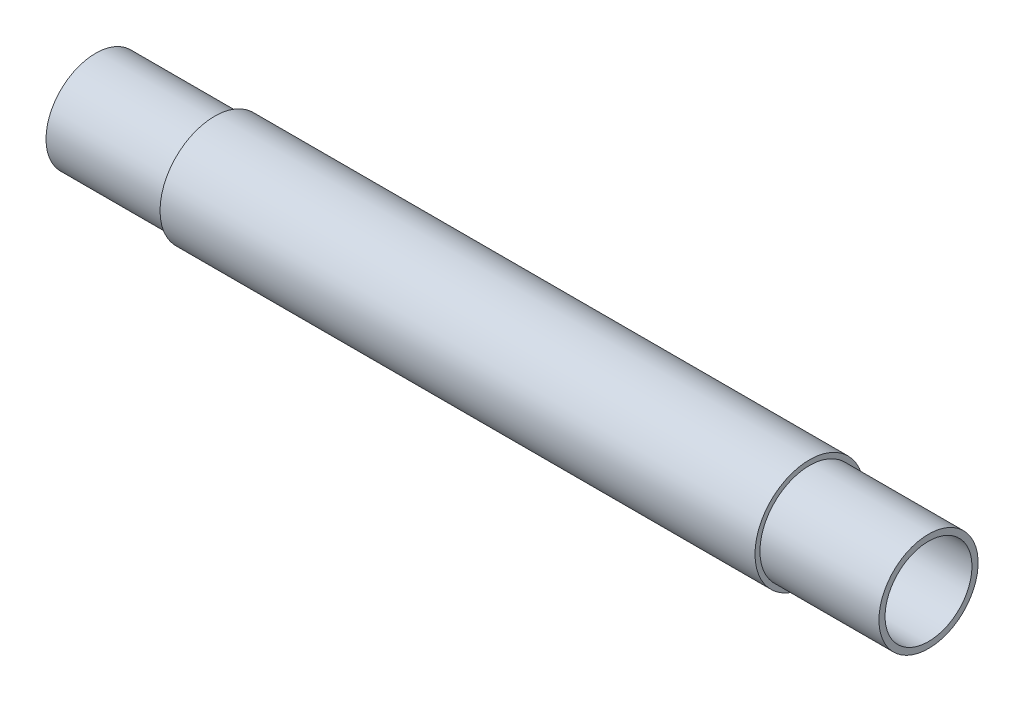
ISO-10303-21;
HEADER;
FILE_DESCRIPTION(('STEP AP214'),'2;1');
FILE_NAME('part.step','',(''),(''),'','','');
FILE_SCHEMA(('AUTOMOTIVE_DESIGN { 1 0 10303 214 1 1 1 1 }'));
ENDSEC;
DATA;
#1=APPLICATION_CONTEXT('core data for automotive mechanical design processes');
#2=APPLICATION_PROTOCOL_DEFINITION('international standard','automotive_design',2000,#1);
#3=PRODUCT_CONTEXT('',#1,'mechanical');
#4=PRODUCT('Part','Part','',(#3));
#5=PRODUCT_RELATED_PRODUCT_CATEGORY('part','',(#4));
#6=PRODUCT_DEFINITION_FORMATION('','',#4);
#7=PRODUCT_DEFINITION_CONTEXT('part definition',#1,'design');
#8=PRODUCT_DEFINITION('design','',#6,#7);
#9=PRODUCT_DEFINITION_SHAPE('','',#8);
#10=(LENGTH_UNIT() NAMED_UNIT(*) SI_UNIT(.MILLI.,.METRE.));
#11=(NAMED_UNIT(*) PLANE_ANGLE_UNIT() SI_UNIT($,.RADIAN.));
#12=(NAMED_UNIT(*) SI_UNIT($,.STERADIAN.) SOLID_ANGLE_UNIT());
#13=UNCERTAINTY_MEASURE_WITH_UNIT(LENGTH_MEASURE(1.E-05),#10,'distance_accuracy_value','');
#14=(GEOMETRIC_REPRESENTATION_CONTEXT(3) GLOBAL_UNCERTAINTY_ASSIGNED_CONTEXT((#13)) GLOBAL_UNIT_ASSIGNED_CONTEXT((#10,
#11,#12)) REPRESENTATION_CONTEXT('',''));
#15=CARTESIAN_POINT('',(0.,0.,0.));
#16=DIRECTION('',(0.,0.,1.));
#17=DIRECTION('',(1.,0.,0.));
#18=AXIS2_PLACEMENT_3D('',#15,#16,#17);
#19=CARTESIAN_POINT('',(91.44,0.,0.));
#20=DIRECTION('',(1.,0.,0.));
#21=DIRECTION('',(0.,0.,-1.));
#22=AXIS2_PLACEMENT_3D('',#19,#20,#21);
#23=PLANE('',#22);
#24=CARTESIAN_POINT('',(91.44,0.,0.));
#25=DIRECTION('',(1.,0.,0.));
#26=DIRECTION('',(0.,0.,-1.));
#27=AXIS2_PLACEMENT_3D('',#24,#25,#26);
#28=CIRCLE('',#27,5.56576257263952);
#29=CARTESIAN_POINT('',(91.44,0.,-5.56576257263952));
#30=VERTEX_POINT('',#29);
#31=EDGE_CURVE('E62',#30,#30,#28,.T.);
#32=ORIENTED_EDGE('',*,*,#31,.F.);
#33=EDGE_LOOP('',(#32));
#34=FACE_BOUND('',#33,.T.);
#35=CARTESIAN_POINT('',(91.44,0.,0.));
#36=DIRECTION('',(-1.,0.,0.));
#37=DIRECTION('',(0.,0.,1.));
#38=AXIS2_PLACEMENT_3D('',#35,#36,#37);
#39=CIRCLE('',#38,6.35);
#40=CARTESIAN_POINT('',(91.44,0.,6.35));
#41=VERTEX_POINT('',#40);
#42=EDGE_CURVE('E41',#41,#41,#39,.T.);
#43=ORIENTED_EDGE('',*,*,#42,.F.);
#44=EDGE_LOOP('',(#43));
#45=FACE_BOUND('',#44,.T.);
#46=ADVANCED_FACE('F34',(#34,#45),#23,.T.);
#47=CARTESIAN_POINT('',(-92.3403256913143,0.,0.));
#48=DIRECTION('',(-1.,0.,0.));
#49=DIRECTION('',(0.,0.,1.));
#50=AXIS2_PLACEMENT_3D('',#47,#48,#49);
#51=CYLINDRICAL_SURFACE('',#50,6.35);
#52=ORIENTED_EDGE('',*,*,#42,.T.);
#53=EDGE_LOOP('',(#52));
#54=FACE_BOUND('',#53,.T.);
#55=CARTESIAN_POINT('',(76.2,0.,0.));
#56=DIRECTION('',(-1.,0.,0.));
#57=DIRECTION('',(0.,0.,1.));
#58=AXIS2_PLACEMENT_3D('',#55,#56,#57);
#59=CIRCLE('',#58,6.35);
#60=CARTESIAN_POINT('',(76.2,0.,6.35));
#61=VERTEX_POINT('',#60);
#62=EDGE_CURVE('E45',#61,#61,#59,.T.);
#63=ORIENTED_EDGE('',*,*,#62,.F.);
#64=EDGE_LOOP('',(#63));
#65=FACE_BOUND('',#64,.T.);
#66=ADVANCED_FACE('F77',(#54,#65),#51,.T.);
#67=CARTESIAN_POINT('',(76.2,0.,0.));
#68=DIRECTION('',(-1.,0.,0.));
#69=DIRECTION('',(0.,0.,1.));
#70=AXIS2_PLACEMENT_3D('',#67,#68,#69);
#71=PLANE('',#70);
#72=CARTESIAN_POINT('',(76.2,0.,0.));
#73=DIRECTION('',(-1.,0.,0.));
#74=DIRECTION('',(0.,0.,1.));
#75=AXIS2_PLACEMENT_3D('',#72,#73,#74);
#76=CIRCLE('',#75,6.985);
#77=CARTESIAN_POINT('',(76.2,0.,6.985));
#78=VERTEX_POINT('',#77);
#79=EDGE_CURVE('E50',#78,#78,#76,.T.);
#80=ORIENTED_EDGE('',*,*,#79,.F.);
#81=EDGE_LOOP('',(#80));
#82=FACE_BOUND('',#81,.T.);
#83=ORIENTED_EDGE('',*,*,#62,.T.);
#84=EDGE_LOOP('',(#83));
#85=FACE_BOUND('',#84,.T.);
#86=ADVANCED_FACE('F74',(#82,#85),#71,.F.);
#87=CARTESIAN_POINT('',(-92.3403256913143,0.,0.));
#88=DIRECTION('',(-1.,0.,0.));
#89=DIRECTION('',(0.,0.,1.));
#90=AXIS2_PLACEMENT_3D('',#87,#88,#89);
#91=CYLINDRICAL_SURFACE('',#90,6.985);
#92=ORIENTED_EDGE('',*,*,#79,.T.);
#93=EDGE_LOOP('',(#92));
#94=FACE_BOUND('',#93,.T.);
#95=CARTESIAN_POINT('',(0.,0.,0.));
#96=DIRECTION('',(-1.,0.,0.));
#97=DIRECTION('',(0.,0.,1.));
#98=AXIS2_PLACEMENT_3D('',#95,#96,#97);
#99=CIRCLE('',#98,6.985);
#100=CARTESIAN_POINT('',(0.,0.,6.985));
#101=VERTEX_POINT('',#100);
#102=EDGE_CURVE('E55',#101,#101,#99,.T.);
#103=ORIENTED_EDGE('',*,*,#102,.F.);
#104=EDGE_LOOP('',(#103));
#105=FACE_BOUND('',#104,.T.);
#106=ADVANCED_FACE('F71',(#94,#105),#91,.T.);
#107=CARTESIAN_POINT('',(0.,0.,0.));
#108=DIRECTION('',(-1.,0.,0.));
#109=DIRECTION('',(0.,0.,1.));
#110=AXIS2_PLACEMENT_3D('',#107,#108,#109);
#111=PLANE('',#110);
#112=CARTESIAN_POINT('',(0.,0.,0.));
#113=DIRECTION('',(-1.,0.,0.));
#114=DIRECTION('',(0.,0.,1.));
#115=AXIS2_PLACEMENT_3D('',#112,#113,#114);
#116=CIRCLE('',#115,6.35);
#117=CARTESIAN_POINT('',(0.,0.,6.35));
#118=VERTEX_POINT('',#117);
#119=EDGE_CURVE('E10',#118,#118,#116,.T.);
#120=ORIENTED_EDGE('',*,*,#119,.F.);
#121=EDGE_LOOP('',(#120));
#122=FACE_BOUND('',#121,.T.);
#123=ORIENTED_EDGE('',*,*,#102,.T.);
#124=EDGE_LOOP('',(#123));
#125=FACE_BOUND('',#124,.T.);
#126=ADVANCED_FACE('F97',(#122,#125),#111,.T.);
#127=CARTESIAN_POINT('',(-15.24,6.35,0.));
#128=DIRECTION('',(1.,0.,0.));
#129=DIRECTION('',(0.,0.,-1.));
#130=AXIS2_PLACEMENT_3D('',#127,#128,#129);
#131=PLANE('',#130);
#132=CARTESIAN_POINT('',(-15.24,0.,0.));
#133=DIRECTION('',(1.,0.,0.));
#134=DIRECTION('',(0.,0.,-1.));
#135=AXIS2_PLACEMENT_3D('',#132,#133,#134);
#136=CIRCLE('',#135,5.56576257263952);
#137=CARTESIAN_POINT('',(-15.24,0.,-5.56576257263952));
#138=VERTEX_POINT('',#137);
#139=EDGE_CURVE('E56',#138,#138,#136,.F.);
#140=ORIENTED_EDGE('',*,*,#139,.F.);
#141=EDGE_LOOP('',(#140));
#142=FACE_BOUND('',#141,.T.);
#143=CARTESIAN_POINT('',(-15.24,0.,0.));
#144=DIRECTION('',(-1.,0.,0.));
#145=DIRECTION('',(0.,0.,1.));
#146=AXIS2_PLACEMENT_3D('',#143,#144,#145);
#147=CIRCLE('',#146,6.35);
#148=CARTESIAN_POINT('',(-15.24,0.,6.35));
#149=VERTEX_POINT('',#148);
#150=EDGE_CURVE('E53',#149,#149,#147,.T.);
#151=ORIENTED_EDGE('',*,*,#150,.T.);
#152=EDGE_LOOP('',(#151));
#153=FACE_BOUND('',#152,.T.);
#154=ADVANCED_FACE('F88',(#142,#153),#131,.F.);
#155=CARTESIAN_POINT('',(-92.3403256913143,0.,0.));
#156=DIRECTION('',(-1.,0.,0.));
#157=DIRECTION('',(0.,0.,1.));
#158=AXIS2_PLACEMENT_3D('',#155,#156,#157);
#159=CYLINDRICAL_SURFACE('',#158,6.35);
#160=ORIENTED_EDGE('',*,*,#150,.F.);
#161=EDGE_LOOP('',(#160));
#162=FACE_BOUND('',#161,.T.);
#163=ORIENTED_EDGE('',*,*,#119,.T.);
#164=EDGE_LOOP('',(#163));
#165=FACE_BOUND('',#164,.T.);
#166=ADVANCED_FACE('F36',(#162,#165),#159,.T.);
#167=CARTESIAN_POINT('',(-30.9823538303507,0.,0.));
#168=DIRECTION('',(1.,0.,0.));
#169=DIRECTION('',(0.,0.,-1.));
#170=AXIS2_PLACEMENT_3D('',#167,#168,#169);
#171=CYLINDRICAL_SURFACE('',#170,5.56576257263952);
#172=ORIENTED_EDGE('',*,*,#139,.T.);
#173=EDGE_LOOP('',(#172));
#174=FACE_BOUND('',#173,.T.);
#175=ORIENTED_EDGE('',*,*,#31,.T.);
#176=EDGE_LOOP('',(#175));
#177=FACE_BOUND('',#176,.T.);
#178=ADVANCED_FACE('F90',(#174,#177),#171,.F.);
#179=CLOSED_SHELL('',(#46,#66,#86,#106,#126,#154,#166,#178));
#180=MANIFOLD_SOLID_BREP('B2',#179);
#181=ADVANCED_BREP_SHAPE_REPRESENTATION('',(#18,#180),#14);
#182=SHAPE_DEFINITION_REPRESENTATION(#9,#181);
ENDSEC;
END-ISO-10303-21;
